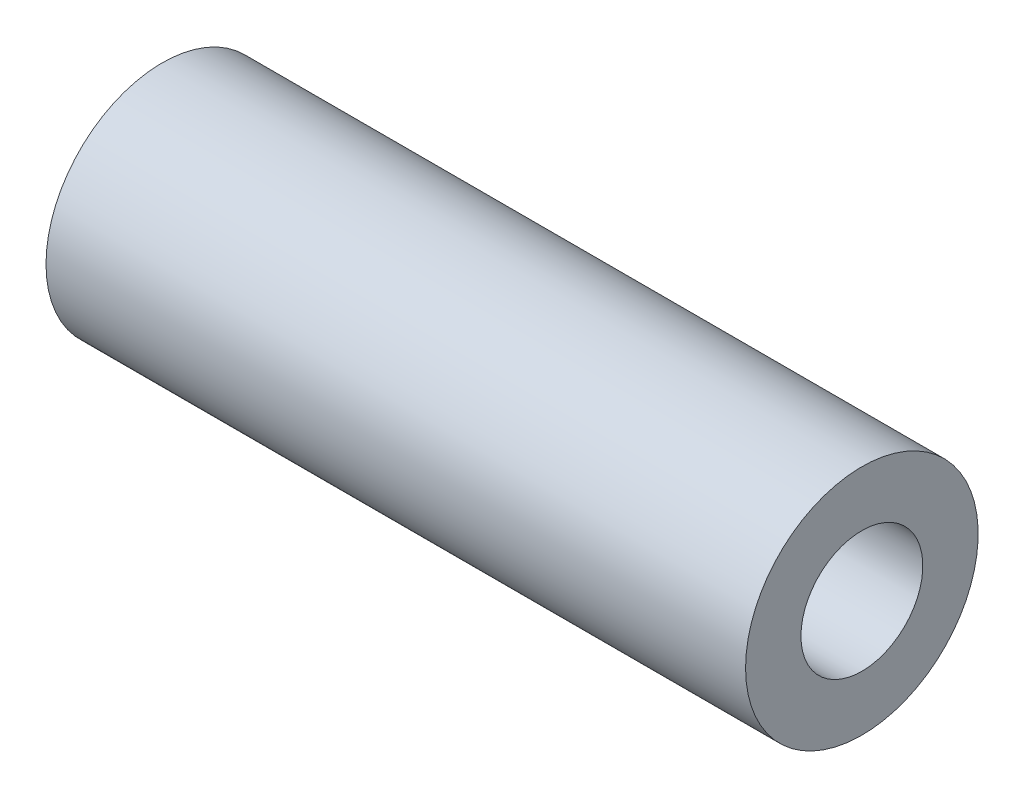
ISO-10303-21;
HEADER;
FILE_DESCRIPTION(('STEP AP214'),'2;1');
FILE_NAME('part.step','',(''),(''),'','','');
FILE_SCHEMA(('AUTOMOTIVE_DESIGN { 1 0 10303 214 1 1 1 1 }'));
ENDSEC;
DATA;
#1=APPLICATION_CONTEXT('core data for automotive mechanical design processes');
#2=APPLICATION_PROTOCOL_DEFINITION('international standard','automotive_design',2000,#1);
#3=PRODUCT_CONTEXT('',#1,'mechanical');
#4=PRODUCT('Part','Part','',(#3));
#5=PRODUCT_RELATED_PRODUCT_CATEGORY('part','',(#4));
#6=PRODUCT_DEFINITION_FORMATION('','',#4);
#7=PRODUCT_DEFINITION_CONTEXT('part definition',#1,'design');
#8=PRODUCT_DEFINITION('design','',#6,#7);
#9=PRODUCT_DEFINITION_SHAPE('','',#8);
#10=(LENGTH_UNIT() NAMED_UNIT(*) SI_UNIT(.MILLI.,.METRE.));
#11=(NAMED_UNIT(*) PLANE_ANGLE_UNIT() SI_UNIT($,.RADIAN.));
#12=(NAMED_UNIT(*) SI_UNIT($,.STERADIAN.) SOLID_ANGLE_UNIT());
#13=UNCERTAINTY_MEASURE_WITH_UNIT(LENGTH_MEASURE(1.E-05),#10,'distance_accuracy_value','');
#14=(GEOMETRIC_REPRESENTATION_CONTEXT(3) GLOBAL_UNCERTAINTY_ASSIGNED_CONTEXT((#13)) GLOBAL_UNIT_ASSIGNED_CONTEXT((#10,
#11,#12)) REPRESENTATION_CONTEXT('',''));
#15=CARTESIAN_POINT('',(0.,0.,0.));
#16=DIRECTION('',(0.,0.,1.));
#17=DIRECTION('',(1.,0.,0.));
#18=AXIS2_PLACEMENT_3D('',#15,#16,#17);
#19=CARTESIAN_POINT('',(14.2875,0.,0.));
#20=DIRECTION('',(-1.,0.,0.));
#21=DIRECTION('',(0.,0.,1.));
#22=AXIS2_PLACEMENT_3D('',#19,#20,#21);
#23=CYLINDRICAL_SURFACE('',#22,2.4892);
#24=CARTESIAN_POINT('',(-14.2875,0.,0.));
#25=DIRECTION('',(-1.,0.,0.));
#26=DIRECTION('',(0.,0.,1.));
#27=AXIS2_PLACEMENT_3D('',#24,#25,#26);
#28=CIRCLE('',#27,2.4892);
#29=CARTESIAN_POINT('',(-14.2875,0.,2.4892));
#30=VERTEX_POINT('',#29);
#31=EDGE_CURVE('E26',#30,#30,#28,.T.);
#32=ORIENTED_EDGE('',*,*,#31,.T.);
#33=EDGE_LOOP('',(#32));
#34=FACE_BOUND('',#33,.T.);
#35=CARTESIAN_POINT('',(14.2875,0.,0.));
#36=DIRECTION('',(-1.,0.,0.));
#37=DIRECTION('',(0.,0.,1.));
#38=AXIS2_PLACEMENT_3D('',#35,#36,#37);
#39=CIRCLE('',#38,2.4892);
#40=CARTESIAN_POINT('',(14.2875,0.,2.4892));
#41=VERTEX_POINT('',#40);
#42=EDGE_CURVE('E17',#41,#41,#39,.T.);
#43=ORIENTED_EDGE('',*,*,#42,.F.);
#44=EDGE_LOOP('',(#43));
#45=FACE_BOUND('',#44,.T.);
#46=ADVANCED_FACE('F14',(#34,#45),#23,.F.);
#47=CARTESIAN_POINT('',(14.2875,0.,0.));
#48=DIRECTION('',(1.,0.,0.));
#49=DIRECTION('',(0.,0.,-1.));
#50=AXIS2_PLACEMENT_3D('',#47,#48,#49);
#51=PLANE('',#50);
#52=ORIENTED_EDGE('',*,*,#42,.T.);
#53=EDGE_LOOP('',(#52));
#54=FACE_BOUND('',#53,.T.);
#55=CARTESIAN_POINT('',(14.2875,0.,0.));
#56=DIRECTION('',(-1.,0.,0.));
#57=DIRECTION('',(0.,0.,1.));
#58=AXIS2_PLACEMENT_3D('',#55,#56,#57);
#59=CIRCLE('',#58,4.7498);
#60=CARTESIAN_POINT('',(14.2875,0.,4.7498));
#61=VERTEX_POINT('',#60);
#62=EDGE_CURVE('E21',#61,#61,#59,.T.);
#63=ORIENTED_EDGE('',*,*,#62,.F.);
#64=EDGE_LOOP('',(#63));
#65=FACE_BOUND('',#64,.T.);
#66=ADVANCED_FACE('F34',(#54,#65),#51,.T.);
#67=CARTESIAN_POINT('',(-14.2875,0.,0.));
#68=DIRECTION('',(1.,0.,0.));
#69=DIRECTION('',(0.,0.,-1.));
#70=AXIS2_PLACEMENT_3D('',#67,#68,#69);
#71=PLANE('',#70);
#72=ORIENTED_EDGE('',*,*,#31,.F.);
#73=EDGE_LOOP('',(#72));
#74=FACE_BOUND('',#73,.T.);
#75=CARTESIAN_POINT('',(-14.2875,0.,0.));
#76=DIRECTION('',(-1.,0.,0.));
#77=DIRECTION('',(0.,0.,1.));
#78=AXIS2_PLACEMENT_3D('',#75,#76,#77);
#79=CIRCLE('',#78,4.7498);
#80=CARTESIAN_POINT('',(-14.2875,0.,4.7498));
#81=VERTEX_POINT('',#80);
#82=EDGE_CURVE('E10',#81,#81,#79,.F.);
#83=ORIENTED_EDGE('',*,*,#82,.F.);
#84=EDGE_LOOP('',(#83));
#85=FACE_BOUND('',#84,.T.);
#86=ADVANCED_FACE('F42',(#74,#85),#71,.F.);
#87=CARTESIAN_POINT('',(14.2875,0.,0.));
#88=DIRECTION('',(-1.,0.,0.));
#89=DIRECTION('',(0.,0.,1.));
#90=AXIS2_PLACEMENT_3D('',#87,#88,#89);
#91=CYLINDRICAL_SURFACE('',#90,4.7498);
#92=ORIENTED_EDGE('',*,*,#82,.T.);
#93=EDGE_LOOP('',(#92));
#94=FACE_BOUND('',#93,.T.);
#95=ORIENTED_EDGE('',*,*,#62,.T.);
#96=EDGE_LOOP('',(#95));
#97=FACE_BOUND('',#96,.T.);
#98=ADVANCED_FACE('F43',(#94,#97),#91,.T.);
#99=CLOSED_SHELL('',(#46,#66,#86,#98));
#100=MANIFOLD_SOLID_BREP('B1',#99);
#101=ADVANCED_BREP_SHAPE_REPRESENTATION('',(#18,#100),#14);
#102=SHAPE_DEFINITION_REPRESENTATION(#9,#101);
ENDSEC;
END-ISO-10303-21;
